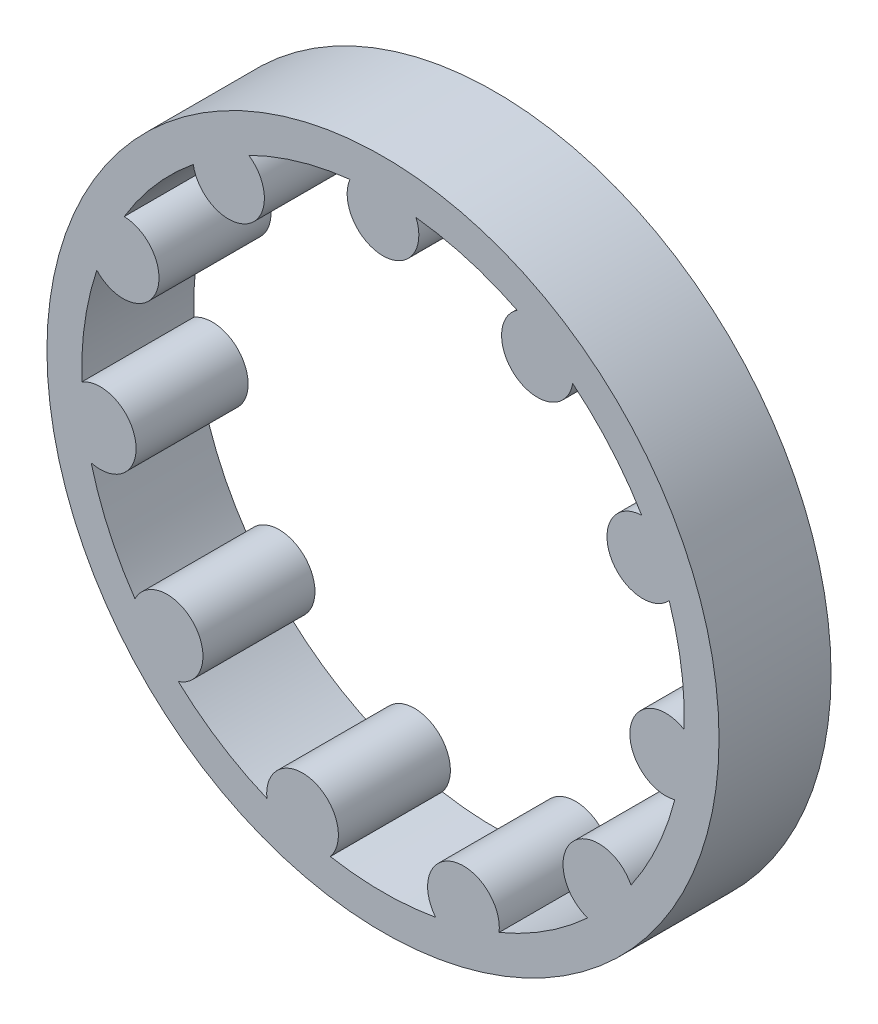
ISO-10303-21;
HEADER;
FILE_DESCRIPTION(('STEP AP214'),'2;1');
FILE_NAME('part.step','',(''),(''),'','','');
FILE_SCHEMA(('AUTOMOTIVE_DESIGN { 1 0 10303 214 1 1 1 1 }'));
ENDSEC;
DATA;
#1=APPLICATION_CONTEXT('core data for automotive mechanical design processes');
#2=APPLICATION_PROTOCOL_DEFINITION('international standard','automotive_design',2000,#1);
#3=PRODUCT_CONTEXT('',#1,'mechanical');
#4=PRODUCT('Part','Part','',(#3));
#5=PRODUCT_RELATED_PRODUCT_CATEGORY('part','',(#4));
#6=PRODUCT_DEFINITION_FORMATION('','',#4);
#7=PRODUCT_DEFINITION_CONTEXT('part definition',#1,'design');
#8=PRODUCT_DEFINITION('design','',#6,#7);
#9=PRODUCT_DEFINITION_SHAPE('','',#8);
#10=(LENGTH_UNIT() NAMED_UNIT(*) SI_UNIT(.MILLI.,.METRE.));
#11=(NAMED_UNIT(*) PLANE_ANGLE_UNIT() SI_UNIT($,.RADIAN.));
#12=(NAMED_UNIT(*) SI_UNIT($,.STERADIAN.) SOLID_ANGLE_UNIT());
#13=UNCERTAINTY_MEASURE_WITH_UNIT(LENGTH_MEASURE(1.E-05),#10,'distance_accuracy_value','');
#14=(GEOMETRIC_REPRESENTATION_CONTEXT(3) GLOBAL_UNCERTAINTY_ASSIGNED_CONTEXT((#13)) GLOBAL_UNIT_ASSIGNED_CONTEXT((#10,
#11,#12)) REPRESENTATION_CONTEXT('',''));
#15=CARTESIAN_POINT('',(0.,0.,0.));
#16=DIRECTION('',(0.,0.,1.));
#17=DIRECTION('',(1.,0.,0.));
#18=AXIS2_PLACEMENT_3D('',#15,#16,#17);
#19=CARTESIAN_POINT('',(0.,0.,10.));
#20=DIRECTION('',(0.,0.,-1.));
#21=DIRECTION('',(-1.,0.,0.));
#22=AXIS2_PLACEMENT_3D('',#19,#20,#21);
#23=CYLINDRICAL_SURFACE('',#22,26.9019457398472);
#24=CARTESIAN_POINT('',(0.,0.,0.));
#25=DIRECTION('',(0.,0.,1.));
#26=DIRECTION('',(1.,0.,0.));
#27=AXIS2_PLACEMENT_3D('',#24,#25,#26);
#28=CIRCLE('',#27,26.9019457398472);
#29=CARTESIAN_POINT('',(-2.95010926224491,26.7396996978369,0.));
#30=VERTEX_POINT('',#29);
#31=CARTESIAN_POINT('',(-11.974783264055,24.0898163207732,0.));
#32=VERTEX_POINT('',#31);
#33=EDGE_CURVE('E277',#30,#32,#28,.T.);
#34=ORIENTED_EDGE('',*,*,#33,.F.);
#35=DIRECTION('',(0.,0.,-1.));
#36=VECTOR('',#35,1.);
#37=CARTESIAN_POINT('',(-2.95010926224491,26.7396996978369,10.));
#38=LINE('',#37,#36);
#39=CARTESIAN_POINT('',(-2.95010926224491,26.7396996978369,10.));
#40=VERTEX_POINT('',#39);
#41=EDGE_CURVE('E11',#40,#30,#38,.T.);
#42=ORIENTED_EDGE('',*,*,#41,.F.);
#43=CARTESIAN_POINT('',(0.,0.,10.));
#44=DIRECTION('',(0.,0.,1.));
#45=DIRECTION('',(1.,0.,0.));
#46=AXIS2_PLACEMENT_3D('',#43,#44,#45);
#47=CIRCLE('',#46,26.9019457398472);
#48=CARTESIAN_POINT('',(-11.974783264055,24.0898163207732,10.));
#49=VERTEX_POINT('',#48);
#50=EDGE_CURVE('E215',#40,#49,#47,.T.);
#51=ORIENTED_EDGE('',*,*,#50,.T.);
#52=DIRECTION('',(0.,0.,-1.));
#53=VECTOR('',#52,1.);
#54=CARTESIAN_POINT('',(-11.974783264055,24.0898163207732,10.));
#55=LINE('',#54,#53);
#56=EDGE_CURVE('E132',#49,#32,#55,.T.);
#57=ORIENTED_EDGE('',*,*,#56,.T.);
#58=EDGE_LOOP('',(#34,#42,#51,#57));
#59=FACE_BOUND('',#58,.T.);
#60=ADVANCED_FACE('F39',(#59),#23,.F.);
#61=CARTESIAN_POINT('',(0.,25.5,10.));
#62=DIRECTION('',(0.,0.,-1.));
#63=DIRECTION('',(-1.,0.,0.));
#64=AXIS2_PLACEMENT_3D('',#61,#62,#63);
#65=CYLINDRICAL_SURFACE('',#64,3.2);
#66=CARTESIAN_POINT('',(0.,25.5,0.));
#67=DIRECTION('',(0.,0.,1.));
#68=DIRECTION('',(1.,0.,0.));
#69=AXIS2_PLACEMENT_3D('',#66,#67,#68);
#70=CIRCLE('',#69,3.2);
#71=CARTESIAN_POINT('',(2.95010926224491,26.7396996978369,0.));
#72=VERTEX_POINT('',#71);
#73=EDGE_CURVE('E280',#30,#72,#70,.T.);
#74=ORIENTED_EDGE('',*,*,#73,.T.);
#75=DIRECTION('',(0.,0.,-1.));
#76=VECTOR('',#75,1.);
#77=CARTESIAN_POINT('',(2.95010926224491,26.7396996978369,10.));
#78=LINE('',#77,#76);
#79=CARTESIAN_POINT('',(2.95010926224491,26.7396996978369,10.));
#80=VERTEX_POINT('',#79);
#81=EDGE_CURVE('E48',#80,#72,#78,.T.);
#82=ORIENTED_EDGE('',*,*,#81,.F.);
#83=CARTESIAN_POINT('',(0.,25.5,10.));
#84=DIRECTION('',(0.,0.,1.));
#85=DIRECTION('',(1.,0.,0.));
#86=AXIS2_PLACEMENT_3D('',#83,#84,#85);
#87=CIRCLE('',#86,3.2);
#88=EDGE_CURVE('E221',#40,#80,#87,.T.);
#89=ORIENTED_EDGE('',*,*,#88,.F.);
#90=ORIENTED_EDGE('',*,*,#41,.T.);
#91=EDGE_LOOP('',(#74,#82,#89,#90));
#92=FACE_BOUND('',#91,.T.);
#93=ADVANCED_FACE('F41',(#92),#65,.T.);
#94=CARTESIAN_POINT('',(11.9747832640534,24.0898163207739,0.));
#95=VERTEX_POINT('',#94);
#96=EDGE_CURVE('E282',#95,#72,#28,.T.);
#97=ORIENTED_EDGE('',*,*,#96,.F.);
#98=DIRECTION('',(0.,0.,-1.));
#99=VECTOR('',#98,1.);
#100=CARTESIAN_POINT('',(11.9747832640534,24.0898163207739,10.));
#101=LINE('',#100,#99);
#102=CARTESIAN_POINT('',(11.9747832640534,24.0898163207739,10.));
#103=VERTEX_POINT('',#102);
#104=EDGE_CURVE('E352',#103,#95,#101,.T.);
#105=ORIENTED_EDGE('',*,*,#104,.F.);
#106=EDGE_CURVE('E223',#103,#80,#47,.T.);
#107=ORIENTED_EDGE('',*,*,#106,.T.);
#108=ORIENTED_EDGE('',*,*,#81,.T.);
#109=EDGE_LOOP('',(#97,#105,#107,#108));
#110=FACE_BOUND('',#109,.T.);
#111=ADVANCED_FACE('F355',(#110),#23,.F.);
#112=CARTESIAN_POINT('',(13.7863408451181,21.4519650871963,10.));
#113=DIRECTION('',(0.,0.,-1.));
#114=DIRECTION('',(-1.,0.,0.));
#115=AXIS2_PLACEMENT_3D('',#112,#113,#114);
#116=CYLINDRICAL_SURFACE('',#115,3.2);
#117=CARTESIAN_POINT('',(13.7863408451181,21.4519650871963,0.));
#118=DIRECTION('',(0.,0.,1.));
#119=DIRECTION('',(1.,0.,0.));
#120=AXIS2_PLACEMENT_3D('',#117,#118,#119);
#121=CIRCLE('',#120,3.2);
#122=CARTESIAN_POINT('',(16.9383629422574,20.8999173545266,0.));
#123=VERTEX_POINT('',#122);
#124=EDGE_CURVE('E285',#95,#123,#121,.T.);
#125=ORIENTED_EDGE('',*,*,#124,.T.);
#126=DIRECTION('',(0.,0.,-1.));
#127=VECTOR('',#126,1.);
#128=CARTESIAN_POINT('',(16.9383629422574,20.8999173545266,10.));
#129=LINE('',#128,#127);
#130=CARTESIAN_POINT('',(16.9383629422574,20.8999173545266,10.));
#131=VERTEX_POINT('',#130);
#132=EDGE_CURVE('E350',#131,#123,#129,.T.);
#133=ORIENTED_EDGE('',*,*,#132,.F.);
#134=CARTESIAN_POINT('',(13.7863408451181,21.4519650871963,10.));
#135=DIRECTION('',(0.,0.,1.));
#136=DIRECTION('',(1.,0.,0.));
#137=AXIS2_PLACEMENT_3D('',#134,#135,#136);
#138=CIRCLE('',#137,3.2);
#139=EDGE_CURVE('E228',#103,#131,#138,.T.);
#140=ORIENTED_EDGE('',*,*,#139,.F.);
#141=ORIENTED_EDGE('',*,*,#104,.T.);
#142=EDGE_LOOP('',(#125,#133,#140,#141));
#143=FACE_BOUND('',#142,.T.);
#144=ADVANCED_FACE('F404',(#143),#116,.T.);
#145=CARTESIAN_POINT('',(23.0977667137904,13.791586472375,0.));
#146=VERTEX_POINT('',#145);
#147=EDGE_CURVE('E288',#146,#123,#28,.T.);
#148=ORIENTED_EDGE('',*,*,#147,.F.);
#149=DIRECTION('',(0.,0.,-1.));
#150=VECTOR('',#149,1.);
#151=CARTESIAN_POINT('',(23.0977667137904,13.791586472375,10.));
#152=LINE('',#151,#150);
#153=CARTESIAN_POINT('',(23.0977667137904,13.791586472375,10.));
#154=VERTEX_POINT('',#153);
#155=EDGE_CURVE('E348',#154,#146,#152,.T.);
#156=ORIENTED_EDGE('',*,*,#155,.F.);
#157=EDGE_CURVE('E229',#154,#131,#47,.T.);
#158=ORIENTED_EDGE('',*,*,#157,.T.);
#159=ORIENTED_EDGE('',*,*,#132,.T.);
#160=EDGE_LOOP('',(#148,#156,#158,#159));
#161=FACE_BOUND('',#160,.T.);
#162=ADVANCED_FACE('F405',(#161),#23,.F.);
#163=CARTESIAN_POINT('',(23.1956158815415,10.5930828315501,10.));
#164=DIRECTION('',(0.,0.,-1.));
#165=DIRECTION('',(-1.,0.,0.));
#166=AXIS2_PLACEMENT_3D('',#163,#164,#165);
#167=CYLINDRICAL_SURFACE('',#166,3.2);
#168=CARTESIAN_POINT('',(23.1956158815415,10.5930828315501,0.));
#169=DIRECTION('',(0.,0.,1.));
#170=DIRECTION('',(1.,0.,0.));
#171=AXIS2_PLACEMENT_3D('',#168,#169,#170);
#172=CIRCLE('',#171,3.2);
#173=CARTESIAN_POINT('',(25.5488060688563,8.4245589229142,0.));
#174=VERTEX_POINT('',#173);
#175=EDGE_CURVE('E289',#146,#174,#172,.T.);
#176=ORIENTED_EDGE('',*,*,#175,.T.);
#177=DIRECTION('',(0.,0.,-1.));
#178=VECTOR('',#177,1.);
#179=CARTESIAN_POINT('',(25.5488060688563,8.4245589229142,10.));
#180=LINE('',#179,#178);
#181=CARTESIAN_POINT('',(25.5488060688563,8.4245589229142,10.));
#182=VERTEX_POINT('',#181);
#183=EDGE_CURVE('E346',#182,#174,#180,.T.);
#184=ORIENTED_EDGE('',*,*,#183,.F.);
#185=CARTESIAN_POINT('',(23.1956158815415,10.5930828315501,10.));
#186=DIRECTION('',(0.,0.,1.));
#187=DIRECTION('',(1.,0.,0.));
#188=AXIS2_PLACEMENT_3D('',#185,#186,#187);
#189=CIRCLE('',#188,3.2);
#190=EDGE_CURVE('E234',#154,#182,#189,.T.);
#191=ORIENTED_EDGE('',*,*,#190,.F.);
#192=ORIENTED_EDGE('',*,*,#155,.T.);
#193=EDGE_LOOP('',(#176,#184,#191,#192));
#194=FACE_BOUND('',#193,.T.);
#195=ADVANCED_FACE('F411',(#194),#167,.T.);
#196=CARTESIAN_POINT('',(26.8873724329211,-0.885374634308747,0.));
#197=VERTEX_POINT('',#196);
#198=EDGE_CURVE('E292',#197,#174,#28,.T.);
#199=ORIENTED_EDGE('',*,*,#198,.F.);
#200=DIRECTION('',(0.,0.,-1.));
#201=VECTOR('',#200,1.);
#202=CARTESIAN_POINT('',(26.8873724329211,-0.885374634308747,10.));
#203=LINE('',#202,#201);
#204=CARTESIAN_POINT('',(26.8873724329211,-0.885374634308747,10.));
#205=VERTEX_POINT('',#204);
#206=EDGE_CURVE('E344',#205,#197,#203,.T.);
#207=ORIENTED_EDGE('',*,*,#206,.F.);
#208=EDGE_CURVE('E235',#205,#182,#47,.T.);
#209=ORIENTED_EDGE('',*,*,#208,.T.);
#210=ORIENTED_EDGE('',*,*,#183,.T.);
#211=EDGE_LOOP('',(#199,#207,#209,#210));
#212=FACE_BOUND('',#211,.T.);
#213=ADVANCED_FACE('F412',(#212),#23,.F.);
#214=CARTESIAN_POINT('',(25.2404467679663,-3.62902837596662,10.));
#215=DIRECTION('',(0.,0.,-1.));
#216=DIRECTION('',(-1.,0.,0.));
#217=AXIS2_PLACEMENT_3D('',#214,#215,#216);
#218=CYLINDRICAL_SURFACE('',#217,3.2);
#219=CARTESIAN_POINT('',(25.2404467679663,-3.62902837596662,0.));
#220=DIRECTION('',(0.,0.,1.));
#221=DIRECTION('',(1.,0.,0.));
#222=AXIS2_PLACEMENT_3D('',#219,#220,#221);
#223=CIRCLE('',#222,3.2);
#224=CARTESIAN_POINT('',(26.0476837878315,-6.72553744163381,0.));
#225=VERTEX_POINT('',#224);
#226=EDGE_CURVE('E293',#197,#225,#223,.T.);
#227=ORIENTED_EDGE('',*,*,#226,.T.);
#228=DIRECTION('',(0.,0.,-1.));
#229=VECTOR('',#228,1.);
#230=CARTESIAN_POINT('',(26.0476837878315,-6.72553744163381,10.));
#231=LINE('',#230,#229);
#232=CARTESIAN_POINT('',(26.0476837878315,-6.72553744163381,10.));
#233=VERTEX_POINT('',#232);
#234=EDGE_CURVE('E342',#233,#225,#231,.T.);
#235=ORIENTED_EDGE('',*,*,#234,.F.);
#236=CARTESIAN_POINT('',(25.2404467679663,-3.62902837596662,10.));
#237=DIRECTION('',(0.,0.,1.));
#238=DIRECTION('',(1.,0.,0.));
#239=AXIS2_PLACEMENT_3D('',#236,#237,#238);
#240=CIRCLE('',#239,3.2);
#241=EDGE_CURVE('E240',#205,#233,#240,.T.);
#242=ORIENTED_EDGE('',*,*,#241,.F.);
#243=ORIENTED_EDGE('',*,*,#206,.T.);
#244=EDGE_LOOP('',(#227,#235,#242,#243));
#245=FACE_BOUND('',#244,.T.);
#246=ADVANCED_FACE('F419',(#245),#218,.T.);
#247=CARTESIAN_POINT('',(22.1404273816959,-15.2812355503581,0.));
#248=VERTEX_POINT('',#247);
#249=EDGE_CURVE('E296',#248,#225,#28,.T.);
#250=ORIENTED_EDGE('',*,*,#249,.F.);
#251=DIRECTION('',(0.,0.,-1.));
#252=VECTOR('',#251,1.);
#253=CARTESIAN_POINT('',(22.1404273816959,-15.2812355503581,10.));
#254=LINE('',#253,#252);
#255=CARTESIAN_POINT('',(22.1404273816959,-15.2812355503581,10.));
#256=VERTEX_POINT('',#255);
#257=EDGE_CURVE('E340',#256,#248,#254,.T.);
#258=ORIENTED_EDGE('',*,*,#257,.F.);
#259=EDGE_CURVE('E241',#256,#233,#47,.T.);
#260=ORIENTED_EDGE('',*,*,#259,.T.);
#261=ORIENTED_EDGE('',*,*,#234,.T.);
#262=EDGE_LOOP('',(#250,#258,#260,#261));
#263=FACE_BOUND('',#262,.T.);
#264=ADVANCED_FACE('F420',(#263),#23,.F.);
#265=CARTESIAN_POINT('',(19.2716141460372,-16.6989487156031,10.));
#266=DIRECTION('',(0.,0.,-1.));
#267=DIRECTION('',(-1.,0.,0.));
#268=AXIS2_PLACEMENT_3D('',#265,#266,#267);
#269=CYLINDRICAL_SURFACE('',#268,3.2);
#270=CARTESIAN_POINT('',(19.2716141460372,-16.6989487156031,0.));
#271=DIRECTION('',(0.,0.,1.));
#272=DIRECTION('',(1.,0.,0.));
#273=AXIS2_PLACEMENT_3D('',#270,#271,#272);
#274=CIRCLE('',#273,3.2);
#275=CARTESIAN_POINT('',(18.2766059483107,-19.74032318884,0.));
#276=VERTEX_POINT('',#275);
#277=EDGE_CURVE('E297',#248,#276,#274,.T.);
#278=ORIENTED_EDGE('',*,*,#277,.T.);
#279=DIRECTION('',(0.,0.,-1.));
#280=VECTOR('',#279,1.);
#281=CARTESIAN_POINT('',(18.2766059483107,-19.74032318884,10.));
#282=LINE('',#281,#280);
#283=CARTESIAN_POINT('',(18.2766059483107,-19.74032318884,10.));
#284=VERTEX_POINT('',#283);
#285=EDGE_CURVE('E338',#284,#276,#282,.T.);
#286=ORIENTED_EDGE('',*,*,#285,.F.);
#287=CARTESIAN_POINT('',(19.2716141460372,-16.6989487156031,10.));
#288=DIRECTION('',(0.,0.,1.));
#289=DIRECTION('',(1.,0.,0.));
#290=AXIS2_PLACEMENT_3D('',#287,#288,#289);
#291=CIRCLE('',#290,3.2);
#292=EDGE_CURVE('E246',#256,#284,#291,.T.);
#293=ORIENTED_EDGE('',*,*,#292,.F.);
#294=ORIENTED_EDGE('',*,*,#257,.T.);
#295=EDGE_LOOP('',(#278,#286,#293,#294));
#296=FACE_BOUND('',#295,.T.);
#297=ADVANCED_FACE('F427',(#296),#269,.T.);
#298=CARTESIAN_POINT('',(10.364053073567,-24.8254121512205,0.));
#299=VERTEX_POINT('',#298);
#300=EDGE_CURVE('E300',#299,#276,#28,.T.);
#301=ORIENTED_EDGE('',*,*,#300,.F.);
#302=DIRECTION('',(0.,0.,-1.));
#303=VECTOR('',#302,1.);
#304=CARTESIAN_POINT('',(10.364053073567,-24.8254121512205,10.));
#305=LINE('',#304,#303);
#306=CARTESIAN_POINT('',(10.364053073567,-24.8254121512205,10.));
#307=VERTEX_POINT('',#306);
#308=EDGE_CURVE('E336',#307,#299,#305,.T.);
#309=ORIENTED_EDGE('',*,*,#308,.F.);
#310=EDGE_CURVE('E247',#307,#284,#47,.T.);
#311=ORIENTED_EDGE('',*,*,#310,.T.);
#312=ORIENTED_EDGE('',*,*,#285,.T.);
#313=EDGE_LOOP('',(#301,#309,#311,#312));
#314=FACE_BOUND('',#313,.T.);
#315=ADVANCED_FACE('F428',(#314),#23,.F.);
#316=CARTESIAN_POINT('',(7.18418019946071,-24.4670708271691,10.));
#317=DIRECTION('',(0.,0.,-1.));
#318=DIRECTION('',(-1.,0.,0.));
#319=AXIS2_PLACEMENT_3D('',#316,#317,#318);
#320=CYLINDRICAL_SURFACE('',#319,3.2);
#321=CARTESIAN_POINT('',(7.18418019946071,-24.4670708271691,0.));
#322=DIRECTION('',(0.,0.,1.));
#323=DIRECTION('',(1.,0.,0.));
#324=AXIS2_PLACEMENT_3D('',#321,#322,#323);
#325=CIRCLE('',#324,3.2);
#326=CARTESIAN_POINT('',(4.70283485652869,-26.4876958020493,0.));
#327=VERTEX_POINT('',#326);
#328=EDGE_CURVE('E301',#299,#327,#325,.T.);
#329=ORIENTED_EDGE('',*,*,#328,.T.);
#330=DIRECTION('',(0.,0.,-1.));
#331=VECTOR('',#330,1.);
#332=CARTESIAN_POINT('',(4.70283485652869,-26.4876958020493,10.));
#333=LINE('',#332,#331);
#334=CARTESIAN_POINT('',(4.70283485652869,-26.4876958020493,10.));
#335=VERTEX_POINT('',#334);
#336=EDGE_CURVE('E334',#335,#327,#333,.T.);
#337=ORIENTED_EDGE('',*,*,#336,.F.);
#338=CARTESIAN_POINT('',(7.18418019946071,-24.4670708271691,10.));
#339=DIRECTION('',(0.,0.,1.));
#340=DIRECTION('',(1.,0.,0.));
#341=AXIS2_PLACEMENT_3D('',#338,#339,#340);
#342=CIRCLE('',#341,3.2);
#343=EDGE_CURVE('E252',#307,#335,#342,.T.);
#344=ORIENTED_EDGE('',*,*,#343,.F.);
#345=ORIENTED_EDGE('',*,*,#308,.T.);
#346=EDGE_LOOP('',(#329,#337,#344,#345));
#347=FACE_BOUND('',#346,.T.);
#348=ADVANCED_FACE('F435',(#347),#320,.T.);
#349=CARTESIAN_POINT('',(-4.70283485652039,-26.4876958020508,0.));
#350=VERTEX_POINT('',#349);
#351=EDGE_CURVE('E304',#350,#327,#28,.T.);
#352=ORIENTED_EDGE('',*,*,#351,.F.);
#353=DIRECTION('',(0.,0.,-1.));
#354=VECTOR('',#353,1.);
#355=CARTESIAN_POINT('',(-4.70283485652039,-26.4876958020508,10.));
#356=LINE('',#355,#354);
#357=CARTESIAN_POINT('',(-4.70283485652039,-26.4876958020508,10.));
#358=VERTEX_POINT('',#357);
#359=EDGE_CURVE('E332',#358,#350,#356,.T.);
#360=ORIENTED_EDGE('',*,*,#359,.F.);
#361=EDGE_CURVE('E253',#358,#335,#47,.T.);
#362=ORIENTED_EDGE('',*,*,#361,.T.);
#363=ORIENTED_EDGE('',*,*,#336,.T.);
#364=EDGE_LOOP('',(#352,#360,#362,#363));
#365=FACE_BOUND('',#364,.T.);
#366=ADVANCED_FACE('F436',(#365),#23,.F.);
#367=CARTESIAN_POINT('',(-7.1841801994522,-24.4670708271703,10.));
#368=DIRECTION('',(0.,0.,-1.));
#369=DIRECTION('',(-1.,0.,0.));
#370=AXIS2_PLACEMENT_3D('',#367,#368,#369);
#371=CYLINDRICAL_SURFACE('',#370,3.2);
#372=CARTESIAN_POINT('',(-7.1841801994522,-24.4670708271703,0.));
#373=DIRECTION('',(0.,0.,1.));
#374=DIRECTION('',(1.,0.,0.));
#375=AXIS2_PLACEMENT_3D('',#372,#373,#374);
#376=CIRCLE('',#375,3.2);
#377=CARTESIAN_POINT('',(-10.3640530735582,-24.8254121512242,0.));
#378=VERTEX_POINT('',#377);
#379=EDGE_CURVE('E305',#350,#378,#376,.T.);
#380=ORIENTED_EDGE('',*,*,#379,.T.);
#381=DIRECTION('',(0.,0.,-1.));
#382=VECTOR('',#381,1.);
#383=CARTESIAN_POINT('',(-10.3640530735582,-24.8254121512242,10.));
#384=LINE('',#383,#382);
#385=CARTESIAN_POINT('',(-10.3640530735582,-24.8254121512242,10.));
#386=VERTEX_POINT('',#385);
#387=EDGE_CURVE('E330',#386,#378,#384,.T.);
#388=ORIENTED_EDGE('',*,*,#387,.F.);
#389=CARTESIAN_POINT('',(-7.1841801994522,-24.4670708271703,10.));
#390=DIRECTION('',(0.,0.,1.));
#391=DIRECTION('',(1.,0.,0.));
#392=AXIS2_PLACEMENT_3D('',#389,#390,#391);
#393=CIRCLE('',#392,3.2);
#394=EDGE_CURVE('E258',#358,#386,#393,.T.);
#395=ORIENTED_EDGE('',*,*,#394,.F.);
#396=ORIENTED_EDGE('',*,*,#359,.T.);
#397=EDGE_LOOP('',(#380,#388,#395,#396));
#398=FACE_BOUND('',#397,.T.);
#399=ADVANCED_FACE('F443',(#398),#371,.T.);
#400=CARTESIAN_POINT('',(-18.2766059483062,-19.7403231888442,0.));
#401=VERTEX_POINT('',#400);
#402=EDGE_CURVE('E308',#401,#378,#28,.T.);
#403=ORIENTED_EDGE('',*,*,#402,.F.);
#404=DIRECTION('',(0.,0.,-1.));
#405=VECTOR('',#404,1.);
#406=CARTESIAN_POINT('',(-18.2766059483062,-19.7403231888442,10.));
#407=LINE('',#406,#405);
#408=CARTESIAN_POINT('',(-18.2766059483062,-19.7403231888442,10.));
#409=VERTEX_POINT('',#408);
#410=EDGE_CURVE('E328',#409,#401,#407,.T.);
#411=ORIENTED_EDGE('',*,*,#410,.F.);
#412=EDGE_CURVE('E259',#409,#386,#47,.T.);
#413=ORIENTED_EDGE('',*,*,#412,.T.);
#414=ORIENTED_EDGE('',*,*,#387,.T.);
#415=EDGE_LOOP('',(#403,#411,#413,#414));
#416=FACE_BOUND('',#415,.T.);
#417=ADVANCED_FACE('F444',(#416),#23,.F.);
#418=CARTESIAN_POINT('',(-19.27161414603,-16.6989487156064,10.));
#419=DIRECTION('',(0.,0.,-1.));
#420=DIRECTION('',(-1.,0.,0.));
#421=AXIS2_PLACEMENT_3D('',#418,#419,#420);
#422=CYLINDRICAL_SURFACE('',#421,3.2);
#423=CARTESIAN_POINT('',(-19.27161414603,-16.6989487156064,0.));
#424=DIRECTION('',(0.,0.,1.));
#425=DIRECTION('',(1.,0.,0.));
#426=AXIS2_PLACEMENT_3D('',#423,#424,#425);
#427=CIRCLE('',#426,3.2);
#428=CARTESIAN_POINT('',(-22.1404273816908,-15.2812355503655,0.));
#429=VERTEX_POINT('',#428);
#430=EDGE_CURVE('E309',#401,#429,#427,.T.);
#431=ORIENTED_EDGE('',*,*,#430,.T.);
#432=DIRECTION('',(0.,0.,-1.));
#433=VECTOR('',#432,1.);
#434=CARTESIAN_POINT('',(-22.1404273816908,-15.2812355503655,10.));
#435=LINE('',#434,#433);
#436=CARTESIAN_POINT('',(-22.1404273816908,-15.2812355503655,10.));
#437=VERTEX_POINT('',#436);
#438=EDGE_CURVE('E326',#437,#429,#435,.T.);
#439=ORIENTED_EDGE('',*,*,#438,.F.);
#440=CARTESIAN_POINT('',(-19.27161414603,-16.6989487156064,10.));
#441=DIRECTION('',(0.,0.,1.));
#442=DIRECTION('',(1.,0.,0.));
#443=AXIS2_PLACEMENT_3D('',#440,#441,#442);
#444=CIRCLE('',#443,3.2);
#445=EDGE_CURVE('E264',#409,#437,#444,.T.);
#446=ORIENTED_EDGE('',*,*,#445,.F.);
#447=ORIENTED_EDGE('',*,*,#410,.T.);
#448=EDGE_LOOP('',(#431,#439,#446,#447));
#449=FACE_BOUND('',#448,.T.);
#450=ADVANCED_FACE('F451',(#449),#422,.T.);
#451=CARTESIAN_POINT('',(-26.0476837878307,-6.72553744163702,0.));
#452=VERTEX_POINT('',#451);
#453=EDGE_CURVE('E312',#452,#429,#28,.T.);
#454=ORIENTED_EDGE('',*,*,#453,.F.);
#455=DIRECTION('',(0.,0.,-1.));
#456=VECTOR('',#455,1.);
#457=CARTESIAN_POINT('',(-26.0476837878307,-6.72553744163702,10.));
#458=LINE('',#457,#456);
#459=CARTESIAN_POINT('',(-26.0476837878307,-6.72553744163702,10.));
#460=VERTEX_POINT('',#459);
#461=EDGE_CURVE('E324',#460,#452,#458,.T.);
#462=ORIENTED_EDGE('',*,*,#461,.F.);
#463=EDGE_CURVE('E220',#460,#437,#47,.T.);
#464=ORIENTED_EDGE('',*,*,#463,.T.);
#465=ORIENTED_EDGE('',*,*,#438,.T.);
#466=EDGE_LOOP('',(#454,#462,#464,#465));
#467=FACE_BOUND('',#466,.T.);
#468=ADVANCED_FACE('F452',(#467),#23,.F.);
#469=CARTESIAN_POINT('',(-25.2404467679613,-3.62902837597092,10.));
#470=DIRECTION('',(0.,0.,-1.));
#471=DIRECTION('',(-1.,0.,0.));
#472=AXIS2_PLACEMENT_3D('',#469,#470,#471);
#473=CYLINDRICAL_SURFACE('',#472,3.2);
#474=CARTESIAN_POINT('',(-25.2404467679613,-3.62902837597092,0.));
#475=DIRECTION('',(0.,0.,1.));
#476=DIRECTION('',(1.,0.,0.));
#477=AXIS2_PLACEMENT_3D('',#474,#475,#476);
#478=CIRCLE('',#477,3.2);
#479=CARTESIAN_POINT('',(-26.8873724329208,-0.885374634315881,0.));
#480=VERTEX_POINT('',#479);
#481=EDGE_CURVE('E313',#452,#480,#478,.T.);
#482=ORIENTED_EDGE('',*,*,#481,.T.);
#483=DIRECTION('',(0.,0.,-1.));
#484=VECTOR('',#483,1.);
#485=CARTESIAN_POINT('',(-26.8873724329208,-0.885374634315881,10.));
#486=LINE('',#485,#484);
#487=CARTESIAN_POINT('',(-26.8873724329208,-0.885374634315881,10.));
#488=VERTEX_POINT('',#487);
#489=EDGE_CURVE('E322',#488,#480,#486,.T.);
#490=ORIENTED_EDGE('',*,*,#489,.F.);
#491=CARTESIAN_POINT('',(-25.2404467679613,-3.62902837597092,10.));
#492=DIRECTION('',(0.,0.,1.));
#493=DIRECTION('',(1.,0.,0.));
#494=AXIS2_PLACEMENT_3D('',#491,#492,#493);
#495=CIRCLE('',#494,3.2);
#496=EDGE_CURVE('E219',#460,#488,#495,.T.);
#497=ORIENTED_EDGE('',*,*,#496,.F.);
#498=ORIENTED_EDGE('',*,*,#461,.T.);
#499=EDGE_LOOP('',(#482,#490,#497,#498));
#500=FACE_BOUND('',#499,.T.);
#501=ADVANCED_FACE('F459',(#500),#473,.T.);
#502=CARTESIAN_POINT('',(-25.5488060688566,8.42455892291331,0.));
#503=VERTEX_POINT('',#502);
#504=EDGE_CURVE('E316',#503,#480,#28,.T.);
#505=ORIENTED_EDGE('',*,*,#504,.F.);
#506=DIRECTION('',(0.,0.,-1.));
#507=VECTOR('',#506,1.);
#508=CARTESIAN_POINT('',(-25.5488060688566,8.42455892291331,10.));
#509=LINE('',#508,#507);
#510=CARTESIAN_POINT('',(-25.5488060688566,8.42455892291331,10.));
#511=VERTEX_POINT('',#510);
#512=EDGE_CURVE('E211',#511,#503,#509,.T.);
#513=ORIENTED_EDGE('',*,*,#512,.F.);
#514=EDGE_CURVE('E200',#511,#488,#47,.T.);
#515=ORIENTED_EDGE('',*,*,#514,.T.);
#516=ORIENTED_EDGE('',*,*,#489,.T.);
#517=EDGE_LOOP('',(#505,#513,#515,#516));
#518=FACE_BOUND('',#517,.T.);
#519=ADVANCED_FACE('F397',(#518),#23,.F.);
#520=CARTESIAN_POINT('',(-23.195615881539,10.5930828315461,10.));
#521=DIRECTION('',(0.,0.,-1.));
#522=DIRECTION('',(-1.,0.,0.));
#523=AXIS2_PLACEMENT_3D('',#520,#521,#522);
#524=CYLINDRICAL_SURFACE('',#523,3.2);
#525=CARTESIAN_POINT('',(-23.195615881539,10.5930828315461,0.));
#526=DIRECTION('',(0.,0.,1.));
#527=DIRECTION('',(1.,0.,0.));
#528=AXIS2_PLACEMENT_3D('',#525,#526,#527);
#529=CIRCLE('',#528,3.2);
#530=CARTESIAN_POINT('',(-23.0977667137926,13.7915864723712,0.));
#531=VERTEX_POINT('',#530);
#532=EDGE_CURVE('E207',#503,#531,#529,.T.);
#533=ORIENTED_EDGE('',*,*,#532,.T.);
#534=DIRECTION('',(0.,0.,-1.));
#535=VECTOR('',#534,1.);
#536=CARTESIAN_POINT('',(-23.0977667137926,13.7915864723712,10.));
#537=LINE('',#536,#535);
#538=CARTESIAN_POINT('',(-23.0977667137926,13.7915864723712,10.));
#539=VERTEX_POINT('',#538);
#540=EDGE_CURVE('E204',#539,#531,#537,.T.);
#541=ORIENTED_EDGE('',*,*,#540,.F.);
#542=CARTESIAN_POINT('',(-23.195615881539,10.5930828315461,10.));
#543=DIRECTION('',(0.,0.,1.));
#544=DIRECTION('',(1.,0.,0.));
#545=AXIS2_PLACEMENT_3D('',#542,#543,#544);
#546=CIRCLE('',#545,3.2);
#547=EDGE_CURVE('E193',#511,#539,#546,.T.);
#548=ORIENTED_EDGE('',*,*,#547,.F.);
#549=ORIENTED_EDGE('',*,*,#512,.T.);
#550=EDGE_LOOP('',(#533,#541,#548,#549));
#551=FACE_BOUND('',#550,.T.);
#552=ADVANCED_FACE('F205',(#551),#524,.T.);
#553=CARTESIAN_POINT('',(-16.9383629422571,20.8999173545268,0.));
#554=VERTEX_POINT('',#553);
#555=EDGE_CURVE('E281',#554,#531,#28,.T.);
#556=ORIENTED_EDGE('',*,*,#555,.F.);
#557=DIRECTION('',(0.,0.,-1.));
#558=VECTOR('',#557,1.);
#559=CARTESIAN_POINT('',(-16.9383629422571,20.8999173545268,10.));
#560=LINE('',#559,#558);
#561=CARTESIAN_POINT('',(-16.9383629422571,20.8999173545268,10.));
#562=VERTEX_POINT('',#561);
#563=EDGE_CURVE('E125',#562,#554,#560,.T.);
#564=ORIENTED_EDGE('',*,*,#563,.F.);
#565=EDGE_CURVE('E198',#562,#539,#47,.T.);
#566=ORIENTED_EDGE('',*,*,#565,.T.);
#567=ORIENTED_EDGE('',*,*,#540,.T.);
#568=EDGE_LOOP('',(#556,#564,#566,#567));
#569=FACE_BOUND('',#568,.T.);
#570=ADVANCED_FACE('F213',(#569),#23,.F.);
#571=CARTESIAN_POINT('',(-13.7863408451174,21.451965087194,10.));
#572=DIRECTION('',(0.,0.,-1.));
#573=DIRECTION('',(-1.,0.,0.));
#574=AXIS2_PLACEMENT_3D('',#571,#572,#573);
#575=CYLINDRICAL_SURFACE('',#574,3.2);
#576=CARTESIAN_POINT('',(-13.7863408451174,21.451965087194,0.));
#577=DIRECTION('',(0.,0.,1.));
#578=DIRECTION('',(1.,0.,0.));
#579=AXIS2_PLACEMENT_3D('',#576,#577,#578);
#580=CIRCLE('',#579,3.2);
#581=EDGE_CURVE('E225',#554,#32,#580,.T.);
#582=ORIENTED_EDGE('',*,*,#581,.T.);
#583=ORIENTED_EDGE('',*,*,#56,.F.);
#584=CARTESIAN_POINT('',(-13.7863408451174,21.451965087194,10.));
#585=DIRECTION('',(0.,0.,1.));
#586=DIRECTION('',(1.,0.,0.));
#587=AXIS2_PLACEMENT_3D('',#584,#585,#586);
#588=CIRCLE('',#587,3.2);
#589=EDGE_CURVE('E56',#562,#49,#588,.T.);
#590=ORIENTED_EDGE('',*,*,#589,.F.);
#591=ORIENTED_EDGE('',*,*,#563,.T.);
#592=EDGE_LOOP('',(#582,#583,#590,#591));
#593=FACE_BOUND('',#592,.T.);
#594=ADVANCED_FACE('F386',(#593),#575,.T.);
#595=CARTESIAN_POINT('',(0.,0.,10.));
#596=DIRECTION('',(0.,0.,-1.));
#597=DIRECTION('',(-1.,0.,0.));
#598=AXIS2_PLACEMENT_3D('',#595,#596,#597);
#599=CYLINDRICAL_SURFACE('',#598,30.);
#600=CARTESIAN_POINT('',(0.,0.,10.));
#601=DIRECTION('',(0.,0.,1.));
#602=DIRECTION('',(1.,0.,0.));
#603=AXIS2_PLACEMENT_3D('',#600,#601,#602);
#604=CIRCLE('',#603,30.);
#605=CARTESIAN_POINT('',(30.,0.,10.));
#606=VERTEX_POINT('',#605);
#607=EDGE_CURVE('E216',#606,#606,#604,.T.);
#608=ORIENTED_EDGE('',*,*,#607,.F.);
#609=EDGE_LOOP('',(#608));
#610=FACE_BOUND('',#609,.T.);
#611=CARTESIAN_POINT('',(0.,0.,0.));
#612=DIRECTION('',(0.,0.,1.));
#613=DIRECTION('',(1.,0.,0.));
#614=AXIS2_PLACEMENT_3D('',#611,#612,#613);
#615=CIRCLE('',#614,30.);
#616=CARTESIAN_POINT('',(30.,0.,0.));
#617=VERTEX_POINT('',#616);
#618=EDGE_CURVE('E222',#617,#617,#615,.T.);
#619=ORIENTED_EDGE('',*,*,#618,.T.);
#620=EDGE_LOOP('',(#619));
#621=FACE_BOUND('',#620,.T.);
#622=ADVANCED_FACE('F388',(#610,#621),#599,.T.);
#623=CARTESIAN_POINT('',(0.,0.,10.));
#624=DIRECTION('',(0.,0.,1.));
#625=DIRECTION('',(1.,0.,0.));
#626=AXIS2_PLACEMENT_3D('',#623,#624,#625);
#627=PLANE('',#626);
#628=ORIENTED_EDGE('',*,*,#50,.F.);
#629=ORIENTED_EDGE('',*,*,#88,.T.);
#630=ORIENTED_EDGE('',*,*,#106,.F.);
#631=ORIENTED_EDGE('',*,*,#139,.T.);
#632=ORIENTED_EDGE('',*,*,#157,.F.);
#633=ORIENTED_EDGE('',*,*,#190,.T.);
#634=ORIENTED_EDGE('',*,*,#208,.F.);
#635=ORIENTED_EDGE('',*,*,#241,.T.);
#636=ORIENTED_EDGE('',*,*,#259,.F.);
#637=ORIENTED_EDGE('',*,*,#292,.T.);
#638=ORIENTED_EDGE('',*,*,#310,.F.);
#639=ORIENTED_EDGE('',*,*,#343,.T.);
#640=ORIENTED_EDGE('',*,*,#361,.F.);
#641=ORIENTED_EDGE('',*,*,#394,.T.);
#642=ORIENTED_EDGE('',*,*,#412,.F.);
#643=ORIENTED_EDGE('',*,*,#445,.T.);
#644=ORIENTED_EDGE('',*,*,#463,.F.);
#645=ORIENTED_EDGE('',*,*,#496,.T.);
#646=ORIENTED_EDGE('',*,*,#514,.F.);
#647=ORIENTED_EDGE('',*,*,#547,.T.);
#648=ORIENTED_EDGE('',*,*,#565,.F.);
#649=ORIENTED_EDGE('',*,*,#589,.T.);
#650=EDGE_LOOP('',(#628,#629,#630,#631,#632,#633,#634,#635,#636,#637,#638,#639,#640,#641,#642,
#643,#644,#645,#646,#647,#648,#649));
#651=FACE_BOUND('',#650,.T.);
#652=ORIENTED_EDGE('',*,*,#607,.T.);
#653=EDGE_LOOP('',(#652));
#654=FACE_BOUND('',#653,.T.);
#655=ADVANCED_FACE('F195',(#651,#654),#627,.T.);
#656=CARTESIAN_POINT('',(0.,0.,0.));
#657=DIRECTION('',(0.,0.,1.));
#658=DIRECTION('',(1.,0.,0.));
#659=AXIS2_PLACEMENT_3D('',#656,#657,#658);
#660=PLANE('',#659);
#661=ORIENTED_EDGE('',*,*,#33,.T.);
#662=ORIENTED_EDGE('',*,*,#581,.F.);
#663=ORIENTED_EDGE('',*,*,#555,.T.);
#664=ORIENTED_EDGE('',*,*,#532,.F.);
#665=ORIENTED_EDGE('',*,*,#504,.T.);
#666=ORIENTED_EDGE('',*,*,#481,.F.);
#667=ORIENTED_EDGE('',*,*,#453,.T.);
#668=ORIENTED_EDGE('',*,*,#430,.F.);
#669=ORIENTED_EDGE('',*,*,#402,.T.);
#670=ORIENTED_EDGE('',*,*,#379,.F.);
#671=ORIENTED_EDGE('',*,*,#351,.T.);
#672=ORIENTED_EDGE('',*,*,#328,.F.);
#673=ORIENTED_EDGE('',*,*,#300,.T.);
#674=ORIENTED_EDGE('',*,*,#277,.F.);
#675=ORIENTED_EDGE('',*,*,#249,.T.);
#676=ORIENTED_EDGE('',*,*,#226,.F.);
#677=ORIENTED_EDGE('',*,*,#198,.T.);
#678=ORIENTED_EDGE('',*,*,#175,.F.);
#679=ORIENTED_EDGE('',*,*,#147,.T.);
#680=ORIENTED_EDGE('',*,*,#124,.F.);
#681=ORIENTED_EDGE('',*,*,#96,.T.);
#682=ORIENTED_EDGE('',*,*,#73,.F.);
#683=EDGE_LOOP('',(#661,#662,#663,#664,#665,#666,#667,#668,#669,#670,#671,#672,#673,#674,#675,
#676,#677,#678,#679,#680,#681,#682));
#684=FACE_BOUND('',#683,.T.);
#685=ORIENTED_EDGE('',*,*,#618,.F.);
#686=EDGE_LOOP('',(#685));
#687=FACE_BOUND('',#686,.T.);
#688=ADVANCED_FACE('F361',(#684,#687),#660,.F.);
#689=CLOSED_SHELL('',(#60,#93,#111,#144,#162,#195,#213,#246,#264,#297,#315,#348,#366,#399,#417,
#450,#468,#501,#519,#552,#570,#594,#622,#655,#688));
#690=MANIFOLD_SOLID_BREP('B2',#689);
#691=ADVANCED_BREP_SHAPE_REPRESENTATION('',(#18,#690),#14);
#692=SHAPE_DEFINITION_REPRESENTATION(#9,#691);
ENDSEC;
END-ISO-10303-21;
